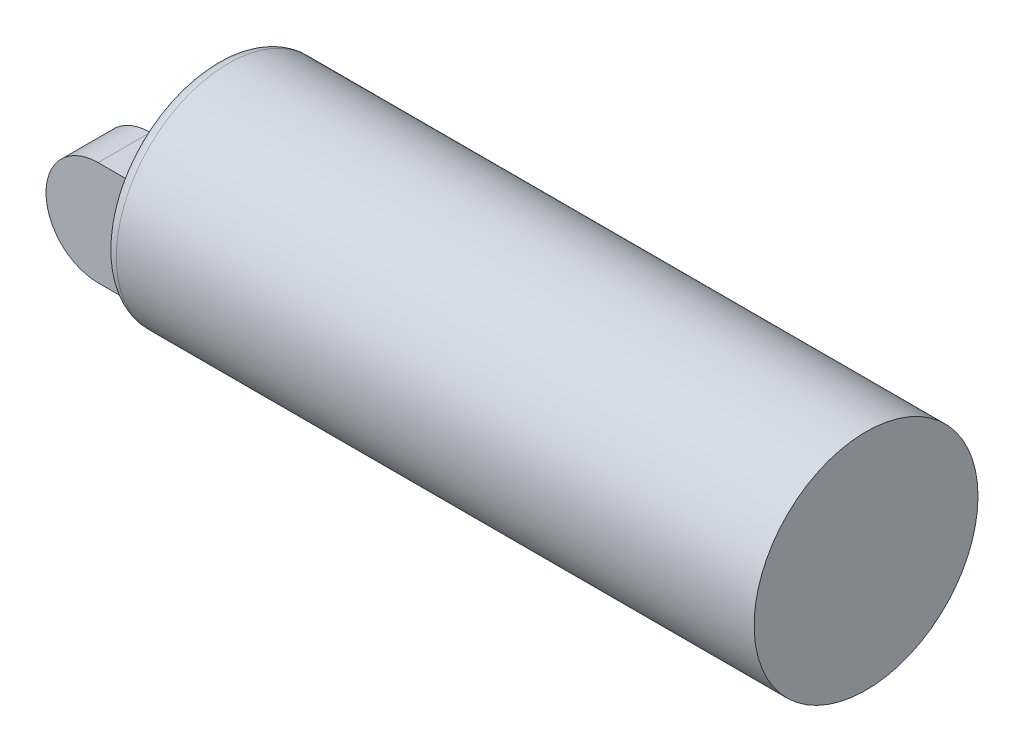
ISO-10303-21;
HEADER;
FILE_DESCRIPTION(('STEP AP214'),'2;1');
FILE_NAME('part.step','',(''),(''),'','','');
FILE_SCHEMA(('AUTOMOTIVE_DESIGN { 1 0 10303 214 1 1 1 1 }'));
ENDSEC;
DATA;
#1=APPLICATION_CONTEXT('core data for automotive mechanical design processes');
#2=APPLICATION_PROTOCOL_DEFINITION('international standard','automotive_design',2000,#1);
#3=PRODUCT_CONTEXT('',#1,'mechanical');
#4=PRODUCT('Part','Part','',(#3));
#5=PRODUCT_RELATED_PRODUCT_CATEGORY('part','',(#4));
#6=PRODUCT_DEFINITION_FORMATION('','',#4);
#7=PRODUCT_DEFINITION_CONTEXT('part definition',#1,'design');
#8=PRODUCT_DEFINITION('design','',#6,#7);
#9=PRODUCT_DEFINITION_SHAPE('','',#8);
#10=(LENGTH_UNIT() NAMED_UNIT(*) SI_UNIT(.MILLI.,.METRE.));
#11=(NAMED_UNIT(*) PLANE_ANGLE_UNIT() SI_UNIT($,.RADIAN.));
#12=(NAMED_UNIT(*) SI_UNIT($,.STERADIAN.) SOLID_ANGLE_UNIT());
#13=UNCERTAINTY_MEASURE_WITH_UNIT(LENGTH_MEASURE(1.E-05),#10,'distance_accuracy_value','');
#14=(GEOMETRIC_REPRESENTATION_CONTEXT(3) GLOBAL_UNCERTAINTY_ASSIGNED_CONTEXT((#13)) GLOBAL_UNIT_ASSIGNED_CONTEXT((#10,
#11,#12)) REPRESENTATION_CONTEXT('',''));
#15=CARTESIAN_POINT('',(0.,0.,0.));
#16=DIRECTION('',(0.,0.,1.));
#17=DIRECTION('',(1.,0.,0.));
#18=AXIS2_PLACEMENT_3D('',#15,#16,#17);
#19=CARTESIAN_POINT('',(-25.,0.,0.));
#20=DIRECTION('',(1.,0.,0.));
#21=DIRECTION('',(0.,0.,-1.));
#22=AXIS2_PLACEMENT_3D('',#19,#20,#21);
#23=PLANE('',#22);
#24=DIRECTION('',(0.,1.,0.));
#25=VECTOR('',#24,1.);
#26=CARTESIAN_POINT('',(-25.,-2.,3.5));
#27=LINE('',#26,#25);
#28=CARTESIAN_POINT('',(-25.,-1.47986485869487,3.5));
#29=VERTEX_POINT('',#28);
#30=CARTESIAN_POINT('',(-25.,1.47986485869487,3.5));
#31=VERTEX_POINT('',#30);
#32=EDGE_CURVE('E157',#29,#31,#27,.T.);
#33=ORIENTED_EDGE('',*,*,#32,.F.);
#34=CARTESIAN_POINT('',(-25.,0.,0.));
#35=DIRECTION('',(1.,0.,0.));
#36=DIRECTION('',(0.,0.,-1.));
#37=AXIS2_PLACEMENT_3D('',#34,#35,#36);
#38=CIRCLE('',#37,3.8);
#39=EDGE_CURVE('E201',#29,#31,#38,.F.);
#40=ORIENTED_EDGE('',*,*,#39,.T.);
#41=EDGE_LOOP('',(#33,#40));
#42=FACE_BOUND('',#41,.T.);
#43=ADVANCED_FACE('F33',(#42),#23,.F.);
#44=DIRECTION('',(0.,0.,1.));
#45=VECTOR('',#44,1.);
#46=CARTESIAN_POINT('',(-25.,2.,-3.5));
#47=LINE('',#46,#45);
#48=CARTESIAN_POINT('',(-25.,2.,1.49));
#49=VERTEX_POINT('',#48);
#50=CARTESIAN_POINT('',(-25.,2.,3.2310988842807));
#51=VERTEX_POINT('',#50);
#52=EDGE_CURVE('E145',#49,#51,#47,.T.);
#53=ORIENTED_EDGE('',*,*,#52,.T.);
#54=CARTESIAN_POINT('',(-25.,0.,0.));
#55=DIRECTION('',(1.,0.,0.));
#56=DIRECTION('',(0.,0.,-1.));
#57=AXIS2_PLACEMENT_3D('',#54,#55,#56);
#58=CIRCLE('',#57,3.8);
#59=CARTESIAN_POINT('',(-25.,2.,-3.2310988842807));
#60=VERTEX_POINT('',#59);
#61=EDGE_CURVE('E199',#51,#60,#58,.F.);
#62=ORIENTED_EDGE('',*,*,#61,.T.);
#63=CARTESIAN_POINT('',(-25.,2.,-1.49));
#64=VERTEX_POINT('',#63);
#65=EDGE_CURVE('E154',#60,#64,#47,.T.);
#66=ORIENTED_EDGE('',*,*,#65,.T.);
#67=DIRECTION('',(0.,-1.,0.));
#68=VECTOR('',#67,1.);
#69=CARTESIAN_POINT('',(-25.,-2.,-1.49));
#70=LINE('',#69,#68);
#71=CARTESIAN_POINT('',(-25.,-2.,-1.49));
#72=VERTEX_POINT('',#71);
#73=EDGE_CURVE('E139',#64,#72,#70,.T.);
#74=ORIENTED_EDGE('',*,*,#73,.T.);
#75=DIRECTION('',(0.,0.,1.));
#76=VECTOR('',#75,1.);
#77=CARTESIAN_POINT('',(-25.,-2.,-3.5));
#78=LINE('',#77,#76);
#79=CARTESIAN_POINT('',(-25.,-2.,-3.2310988842807));
#80=VERTEX_POINT('',#79);
#81=EDGE_CURVE('E164',#80,#72,#78,.T.);
#82=ORIENTED_EDGE('',*,*,#81,.F.);
#83=CARTESIAN_POINT('',(-25.,0.,0.));
#84=DIRECTION('',(1.,0.,0.));
#85=DIRECTION('',(0.,0.,-1.));
#86=AXIS2_PLACEMENT_3D('',#83,#84,#85);
#87=CIRCLE('',#86,3.8);
#88=CARTESIAN_POINT('',(-25.,-2.,3.2310988842807));
#89=VERTEX_POINT('',#88);
#90=EDGE_CURVE('E195',#80,#89,#87,.F.);
#91=ORIENTED_EDGE('',*,*,#90,.T.);
#92=CARTESIAN_POINT('',(-25.,-2.,1.49));
#93=VERTEX_POINT('',#92);
#94=EDGE_CURVE('E148',#93,#89,#78,.T.);
#95=ORIENTED_EDGE('',*,*,#94,.F.);
#96=DIRECTION('',(0.,1.,0.));
#97=VECTOR('',#96,1.);
#98=CARTESIAN_POINT('',(-25.,-2.,1.49));
#99=LINE('',#98,#97);
#100=EDGE_CURVE('E131',#93,#49,#99,.T.);
#101=ORIENTED_EDGE('',*,*,#100,.T.);
#102=EDGE_LOOP('',(#53,#62,#66,#74,#82,#91,#95,#101));
#103=FACE_BOUND('',#102,.T.);
#104=ADVANCED_FACE('F144',(#103),#23,.F.);
#105=CARTESIAN_POINT('',(-26.,0.,3.5));
#106=DIRECTION('',(0.,0.,1.));
#107=DIRECTION('',(1.,0.,0.));
#108=AXIS2_PLACEMENT_3D('',#105,#106,#107);
#109=CYLINDRICAL_SURFACE('',#108,2.);
#110=DIRECTION('',(0.,0.,1.));
#111=VECTOR('',#110,1.);
#112=CARTESIAN_POINT('',(-26.,-2.,-3.5));
#113=LINE('',#112,#111);
#114=CARTESIAN_POINT('',(-26.,-2.,3.5));
#115=VERTEX_POINT('',#114);
#116=CARTESIAN_POINT('',(-26.,-2.,1.49));
#117=VERTEX_POINT('',#116);
#118=EDGE_CURVE('E184',#115,#117,#113,.F.);
#119=ORIENTED_EDGE('',*,*,#118,.F.);
#120=CARTESIAN_POINT('',(-26.,0.,3.5));
#121=DIRECTION('',(0.,0.,-1.));
#122=DIRECTION('',(-1.,0.,0.));
#123=AXIS2_PLACEMENT_3D('',#120,#121,#122);
#124=CIRCLE('',#123,2.);
#125=CARTESIAN_POINT('',(-26.,2.,3.5));
#126=VERTEX_POINT('',#125);
#127=EDGE_CURVE('E189',#126,#115,#124,.F.);
#128=ORIENTED_EDGE('',*,*,#127,.F.);
#129=DIRECTION('',(0.,0.,-1.));
#130=VECTOR('',#129,1.);
#131=CARTESIAN_POINT('',(-26.,2.,3.5));
#132=LINE('',#131,#130);
#133=CARTESIAN_POINT('',(-26.,2.,1.49));
#134=VERTEX_POINT('',#133);
#135=EDGE_CURVE('E187',#134,#126,#132,.F.);
#136=ORIENTED_EDGE('',*,*,#135,.F.);
#137=CARTESIAN_POINT('',(-26.,0.,1.49));
#138=DIRECTION('',(0.,0.,1.));
#139=DIRECTION('',(1.,0.,0.));
#140=AXIS2_PLACEMENT_3D('',#137,#138,#139);
#141=CIRCLE('',#140,2.);
#142=EDGE_CURVE('E133',#117,#134,#141,.F.);
#143=ORIENTED_EDGE('',*,*,#142,.F.);
#144=EDGE_LOOP('',(#119,#128,#136,#143));
#145=FACE_BOUND('',#144,.T.);
#146=ADVANCED_FACE('F273',(#145),#109,.T.);
#147=CARTESIAN_POINT('',(-25.,-2.,1.49));
#148=DIRECTION('',(0.,0.,1.));
#149=DIRECTION('',(1.,0.,0.));
#150=AXIS2_PLACEMENT_3D('',#147,#148,#149);
#151=PLANE('',#150);
#152=DIRECTION('',(-1.,0.,0.));
#153=VECTOR('',#152,1.);
#154=CARTESIAN_POINT('',(-25.,-2.,1.49));
#155=LINE('',#154,#153);
#156=EDGE_CURVE('E159',#93,#117,#155,.T.);
#157=ORIENTED_EDGE('',*,*,#156,.T.);
#158=ORIENTED_EDGE('',*,*,#142,.T.);
#159=DIRECTION('',(-1.,0.,0.));
#160=VECTOR('',#159,1.);
#161=CARTESIAN_POINT('',(-25.,2.,1.49));
#162=LINE('',#161,#160);
#163=EDGE_CURVE('E126',#49,#134,#162,.T.);
#164=ORIENTED_EDGE('',*,*,#163,.F.);
#165=ORIENTED_EDGE('',*,*,#100,.F.);
#166=EDGE_LOOP('',(#157,#158,#164,#165));
#167=FACE_BOUND('',#166,.T.);
#168=CARTESIAN_POINT('',(-26.63,0.,1.49));
#169=DIRECTION('',(0.,0.,1.));
#170=DIRECTION('',(1.,0.,0.));
#171=AXIS2_PLACEMENT_3D('',#168,#169,#170);
#172=CIRCLE('',#171,0.9);
#173=CARTESIAN_POINT('',(-25.73,0.,1.49));
#174=VERTEX_POINT('',#173);
#175=EDGE_CURVE('E320',#174,#174,#172,.T.);
#176=ORIENTED_EDGE('',*,*,#175,.T.);
#177=EDGE_LOOP('',(#176));
#178=FACE_BOUND('',#177,.T.);
#179=ADVANCED_FACE('F129',(#167,#178),#151,.F.);
#180=CARTESIAN_POINT('',(-26.,0.,-1.49));
#181=DIRECTION('',(0.,0.,1.));
#182=DIRECTION('',(1.,0.,0.));
#183=AXIS2_PLACEMENT_3D('',#180,#181,#182);
#184=CYLINDRICAL_SURFACE('',#183,2.);
#185=DIRECTION('',(0.,0.,1.));
#186=VECTOR('',#185,1.);
#187=CARTESIAN_POINT('',(-26.,-2.,-3.5));
#188=LINE('',#187,#186);
#189=CARTESIAN_POINT('',(-26.,-2.,-1.49));
#190=VERTEX_POINT('',#189);
#191=CARTESIAN_POINT('',(-26.,-2.,-3.5));
#192=VERTEX_POINT('',#191);
#193=EDGE_CURVE('E175',#190,#192,#188,.F.);
#194=ORIENTED_EDGE('',*,*,#193,.F.);
#195=CARTESIAN_POINT('',(-26.,0.,-1.49));
#196=DIRECTION('',(0.,0.,-1.));
#197=DIRECTION('',(-1.,0.,0.));
#198=AXIS2_PLACEMENT_3D('',#195,#196,#197);
#199=CIRCLE('',#198,2.);
#200=CARTESIAN_POINT('',(-26.,2.,-1.49));
#201=VERTEX_POINT('',#200);
#202=EDGE_CURVE('E180',#201,#190,#199,.F.);
#203=ORIENTED_EDGE('',*,*,#202,.F.);
#204=DIRECTION('',(0.,0.,-1.));
#205=VECTOR('',#204,1.);
#206=CARTESIAN_POINT('',(-26.,2.,-1.49));
#207=LINE('',#206,#205);
#208=CARTESIAN_POINT('',(-26.,2.,-3.5));
#209=VERTEX_POINT('',#208);
#210=EDGE_CURVE('E177',#209,#201,#207,.F.);
#211=ORIENTED_EDGE('',*,*,#210,.F.);
#212=CARTESIAN_POINT('',(-26.,0.,-3.5));
#213=DIRECTION('',(0.,0.,-1.));
#214=DIRECTION('',(-1.,0.,0.));
#215=AXIS2_PLACEMENT_3D('',#212,#213,#214);
#216=CIRCLE('',#215,2.);
#217=EDGE_CURVE('E182',#192,#209,#216,.T.);
#218=ORIENTED_EDGE('',*,*,#217,.F.);
#219=EDGE_LOOP('',(#194,#203,#211,#218));
#220=FACE_BOUND('',#219,.T.);
#221=ADVANCED_FACE('F298',(#220),#184,.T.);
#222=CARTESIAN_POINT('',(-28.,-2.,-3.5));
#223=DIRECTION('',(0.,1.,0.));
#224=DIRECTION('',(0.,0.,1.));
#225=AXIS2_PLACEMENT_3D('',#222,#223,#224);
#226=PLANE('',#225);
#227=DIRECTION('',(1.,0.,0.));
#228=VECTOR('',#227,1.);
#229=CARTESIAN_POINT('',(-28.,-2.,3.5));
#230=LINE('',#229,#228);
#231=CARTESIAN_POINT('',(-24.9433728042342,-2.,3.5));
#232=VERTEX_POINT('',#231);
#233=EDGE_CURVE('E52',#115,#232,#230,.T.);
#234=ORIENTED_EDGE('',*,*,#233,.F.);
#235=ORIENTED_EDGE('',*,*,#118,.T.);
#236=ORIENTED_EDGE('',*,*,#156,.F.);
#237=ORIENTED_EDGE('',*,*,#94,.T.);
#238=CARTESIAN_POINT('',(-25.,-2.,3.2310988842807));
#239=CARTESIAN_POINT('',(-25.0000224286856,-2.,3.26799843064316));
#240=CARTESIAN_POINT('',(-24.9970462157719,-2.,3.30499777397735));
#241=CARTESIAN_POINT('',(-24.9851167834726,-2.,3.37732640569633));
#242=CARTESIAN_POINT('',(-24.9762719738994,-2.,3.41267375945055));
#243=CARTESIAN_POINT('',(-24.9613562752155,-2.,3.45593418573264));
#244=CARTESIAN_POINT('',(-24.9580571959606,-2.,3.46483796510696));
#245=CARTESIAN_POINT('',(-24.9510333023544,-2.,3.48252516810575));
#246=CARTESIAN_POINT('',(-24.9473065303777,-2.,3.49130781403996));
#247=CARTESIAN_POINT('',(-24.9433728042342,-2.,3.5));
#248=B_SPLINE_CURVE_WITH_KNOTS('',3,(#238,#239,#240,#241,#242,#243,#244,#245,#246,#247),
.UNSPECIFIED.,.F.,.F.,(4,2,2,2,4),(0.,0.110755261121068,0.219519486984609,0.247997830641225,
0.276612155591879),.UNSPECIFIED.);
#249=EDGE_CURVE('E46',#89,#232,#248,.T.);
#250=ORIENTED_EDGE('',*,*,#249,.T.);
#251=EDGE_LOOP('',(#234,#235,#236,#237,#250));
#252=FACE_BOUND('',#251,.T.);
#253=ADVANCED_FACE('F259',(#252),#226,.F.);
#254=CARTESIAN_POINT('',(-28.,2.,-3.5));
#255=DIRECTION('',(0.,1.,0.));
#256=DIRECTION('',(0.,0.,1.));
#257=AXIS2_PLACEMENT_3D('',#254,#255,#256);
#258=PLANE('',#257);
#259=ORIENTED_EDGE('',*,*,#163,.T.);
#260=ORIENTED_EDGE('',*,*,#135,.T.);
#261=DIRECTION('',(1.,0.,0.));
#262=VECTOR('',#261,1.);
#263=CARTESIAN_POINT('',(-28.,2.,3.5));
#264=LINE('',#263,#262);
#265=CARTESIAN_POINT('',(-24.9433728042342,2.,3.5));
#266=VERTEX_POINT('',#265);
#267=EDGE_CURVE('E170',#126,#266,#264,.T.);
#268=ORIENTED_EDGE('',*,*,#267,.T.);
#269=CARTESIAN_POINT('',(-24.9433728042342,2.,3.5));
#270=CARTESIAN_POINT('',(-24.9586289969678,2.,3.46631388491358));
#271=CARTESIAN_POINT('',(-24.9707464773621,2.,3.43127983098381));
#272=CARTESIAN_POINT('',(-24.9886851201952,2.,3.36026003953303));
#273=CARTESIAN_POINT('',(-24.9946100421791,2.,3.32430068713728));
#274=CARTESIAN_POINT('',(-24.9992168971913,2.,3.26915001534335));
#275=CARTESIAN_POINT('',(-25.0000031898991,2.,3.25011531646974));
#276=CARTESIAN_POINT('',(-25.,2.,3.2310988842807));
#277=B_SPLINE_CURVE_WITH_KNOTS('',3,(#269,#270,#271,#272,#273,#274,#275,#276),.UNSPECIFIED.,.F.,
.F.,(4,2,2,4),(0.,0.110697893019595,0.219509705841096,0.276585237461115),.UNSPECIFIED.);
#278=EDGE_CURVE('E153',#266,#51,#277,.T.);
#279=ORIENTED_EDGE('',*,*,#278,.T.);
#280=ORIENTED_EDGE('',*,*,#52,.F.);
#281=EDGE_LOOP('',(#259,#260,#268,#279,#280));
#282=FACE_BOUND('',#281,.T.);
#283=ADVANCED_FACE('F151',(#282),#258,.T.);
#284=CARTESIAN_POINT('',(-25.,0.,0.));
#285=DIRECTION('',(1.,0.,0.));
#286=DIRECTION('',(0.,0.,-1.));
#287=AXIS2_PLACEMENT_3D('',#284,#285,#286);
#288=CYLINDRICAL_SURFACE('',#287,4.3);
#289=CARTESIAN_POINT('',(-24.5,0.,0.));
#290=DIRECTION('',(1.,0.,0.));
#291=DIRECTION('',(0.,0.,-1.));
#292=AXIS2_PLACEMENT_3D('',#289,#290,#291);
#293=CIRCLE('',#292,4.3);
#294=CARTESIAN_POINT('',(-24.5,0.,-4.3));
#295=VERTEX_POINT('',#294);
#296=EDGE_CURVE('E192',#295,#295,#293,.T.);
#297=ORIENTED_EDGE('',*,*,#296,.T.);
#298=EDGE_LOOP('',(#297));
#299=FACE_BOUND('',#298,.T.);
#300=CARTESIAN_POINT('',(0.,0.,0.));
#301=DIRECTION('',(1.,0.,0.));
#302=DIRECTION('',(0.,0.,-1.));
#303=AXIS2_PLACEMENT_3D('',#300,#301,#302);
#304=CIRCLE('',#303,4.3);
#305=CARTESIAN_POINT('',(0.,0.,-4.3));
#306=VERTEX_POINT('',#305);
#307=EDGE_CURVE('E168',#306,#306,#304,.T.);
#308=ORIENTED_EDGE('',*,*,#307,.F.);
#309=EDGE_LOOP('',(#308));
#310=FACE_BOUND('',#309,.T.);
#311=ADVANCED_FACE('F277',(#299,#310),#288,.T.);
#312=DIRECTION('',(0.,1.,0.));
#313=VECTOR('',#312,1.);
#314=CARTESIAN_POINT('',(-25.,-2.,-3.5));
#315=LINE('',#314,#313);
#316=CARTESIAN_POINT('',(-25.,-1.47986485869487,-3.5));
#317=VERTEX_POINT('',#316);
#318=CARTESIAN_POINT('',(-25.,1.47986485869487,-3.5));
#319=VERTEX_POINT('',#318);
#320=EDGE_CURVE('E155',#317,#319,#315,.T.);
#321=ORIENTED_EDGE('',*,*,#320,.T.);
#322=CARTESIAN_POINT('',(-25.,0.,0.));
#323=DIRECTION('',(1.,0.,0.));
#324=DIRECTION('',(0.,0.,-1.));
#325=AXIS2_PLACEMENT_3D('',#322,#323,#324);
#326=CIRCLE('',#325,3.8);
#327=EDGE_CURVE('E197',#319,#317,#326,.F.);
#328=ORIENTED_EDGE('',*,*,#327,.T.);
#329=EDGE_LOOP('',(#321,#328));
#330=FACE_BOUND('',#329,.T.);
#331=ADVANCED_FACE('F268',(#330),#23,.F.);
#332=CARTESIAN_POINT('',(0.,0.,0.));
#333=DIRECTION('',(1.,0.,0.));
#334=DIRECTION('',(0.,0.,-1.));
#335=AXIS2_PLACEMENT_3D('',#332,#333,#334);
#336=PLANE('',#335);
#337=ORIENTED_EDGE('',*,*,#307,.T.);
#338=EDGE_LOOP('',(#337));
#339=FACE_BOUND('',#338,.T.);
#340=ADVANCED_FACE('F276',(#339),#336,.T.);
#341=CARTESIAN_POINT('',(-28.,-2.,-3.5));
#342=DIRECTION('',(0.,0.,-1.));
#343=DIRECTION('',(-1.,0.,0.));
#344=AXIS2_PLACEMENT_3D('',#341,#342,#343);
#345=PLANE('',#344);
#346=DIRECTION('',(1.,0.,0.));
#347=VECTOR('',#346,1.);
#348=CARTESIAN_POINT('',(-28.,-2.,-3.5));
#349=LINE('',#348,#347);
#350=CARTESIAN_POINT('',(-24.9433728042342,-2.,-3.5));
#351=VERTEX_POINT('',#350);
#352=EDGE_CURVE('E60',#192,#351,#349,.T.);
#353=ORIENTED_EDGE('',*,*,#352,.F.);
#354=ORIENTED_EDGE('',*,*,#217,.T.);
#355=DIRECTION('',(1.,0.,0.));
#356=VECTOR('',#355,1.);
#357=CARTESIAN_POINT('',(-28.,2.,-3.5));
#358=LINE('',#357,#356);
#359=CARTESIAN_POINT('',(-24.9433728042342,2.,-3.5));
#360=VERTEX_POINT('',#359);
#361=EDGE_CURVE('E166',#209,#360,#358,.T.);
#362=ORIENTED_EDGE('',*,*,#361,.T.);
#363=CARTESIAN_POINT('',(-24.9433728042342,2.,-3.5));
#364=CARTESIAN_POINT('',(-24.9543202386034,1.95752462015798,-3.5));
#365=CARTESIAN_POINT('',(-24.9632912168686,1.91460189631565,-3.5));
#366=CARTESIAN_POINT('',(-24.9779025624653,1.82835615793533,-3.5));
#367=CARTESIAN_POINT('',(-24.9835557509957,1.78503535023548,-3.5));
#368=CARTESIAN_POINT('',(-24.9922236824024,1.69820403557088,-3.5));
#369=CARTESIAN_POINT('',(-24.9952415601314,1.65469381604158,-3.5));
#370=CARTESIAN_POINT('',(-24.9991281690942,1.56740399604023,-3.5));
#371=CARTESIAN_POINT('',(-24.9999884992702,1.52362400592514,-3.5));
#372=CARTESIAN_POINT('',(-25.,1.47986485869487,-3.5));
#373=B_SPLINE_CURVE_WITH_KNOTS('',3,(#363,#364,#365,#366,#367,#368,#369,#370,#371,#372),
.UNSPECIFIED.,.F.,.F.,(4,2,2,2,4),(0.,0.131457888466224,0.262404370586673,0.393194871360669,
0.524493858895249),.UNSPECIFIED.);
#374=EDGE_CURVE('E239',#360,#319,#373,.T.);
#375=ORIENTED_EDGE('',*,*,#374,.T.);
#376=ORIENTED_EDGE('',*,*,#320,.F.);
#377=CARTESIAN_POINT('',(-25.,-1.47986485869487,-3.5));
#378=CARTESIAN_POINT('',(-24.9999884992702,-1.52362400592514,-3.5));
#379=CARTESIAN_POINT('',(-24.9991281690942,-1.56740399604023,-3.5));
#380=CARTESIAN_POINT('',(-24.9952415601314,-1.65469381604158,-3.5));
#381=CARTESIAN_POINT('',(-24.9922236824024,-1.69820403557088,-3.5));
#382=CARTESIAN_POINT('',(-24.9835557509957,-1.78503535023548,-3.5));
#383=CARTESIAN_POINT('',(-24.9779025624653,-1.82835615793533,-3.5));
#384=CARTESIAN_POINT('',(-24.9632912168686,-1.91460189631565,-3.5));
#385=CARTESIAN_POINT('',(-24.9543202386034,-1.95752462015798,-3.5));
#386=CARTESIAN_POINT('',(-24.9433728042342,-2.,-3.5));
#387=B_SPLINE_CURVE_WITH_KNOTS('',3,(#377,#378,#379,#380,#381,#382,#383,#384,#385,#386),
.UNSPECIFIED.,.F.,.F.,(4,2,2,2,4),(0.,0.13129898753458,0.262089488308577,0.393035970429025,
0.52449385889525),.UNSPECIFIED.);
#388=EDGE_CURVE('E244',#317,#351,#387,.T.);
#389=ORIENTED_EDGE('',*,*,#388,.T.);
#390=EDGE_LOOP('',(#353,#354,#362,#375,#376,#389));
#391=FACE_BOUND('',#390,.T.);
#392=ADVANCED_FACE('F229',(#391),#345,.T.);
#393=DIRECTION('',(-1.,0.,0.));
#394=VECTOR('',#393,1.);
#395=CARTESIAN_POINT('',(-25.,-2.,-1.49));
#396=LINE('',#395,#394);
#397=EDGE_CURVE('E308',#72,#190,#396,.T.);
#398=ORIENTED_EDGE('',*,*,#397,.T.);
#399=ORIENTED_EDGE('',*,*,#193,.T.);
#400=ORIENTED_EDGE('',*,*,#352,.T.);
#401=CARTESIAN_POINT('',(-24.9433728042342,-2.,-3.5));
#402=CARTESIAN_POINT('',(-24.9586289969678,-2.,-3.46631388491358));
#403=CARTESIAN_POINT('',(-24.9707464773621,-2.,-3.43127983098381));
#404=CARTESIAN_POINT('',(-24.9886851201952,-2.,-3.36026003953303));
#405=CARTESIAN_POINT('',(-24.9946100421791,-2.,-3.32430068713728));
#406=CARTESIAN_POINT('',(-24.9992168971913,-2.,-3.26915001534335));
#407=CARTESIAN_POINT('',(-25.0000031898991,-2.,-3.25011531646974));
#408=CARTESIAN_POINT('',(-25.,-2.,-3.2310988842807));
#409=B_SPLINE_CURVE_WITH_KNOTS('',3,(#401,#402,#403,#404,#405,#406,#407,#408),.UNSPECIFIED.,.F.,
.F.,(4,2,2,4),(0.,0.110697893019595,0.219509705841096,0.276585237461116),.UNSPECIFIED.);
#410=EDGE_CURVE('E249',#351,#80,#409,.T.);
#411=ORIENTED_EDGE('',*,*,#410,.T.);
#412=ORIENTED_EDGE('',*,*,#81,.T.);
#413=EDGE_LOOP('',(#398,#399,#400,#411,#412));
#414=FACE_BOUND('',#413,.T.);
#415=ADVANCED_FACE('F220',(#414),#226,.F.);
#416=CARTESIAN_POINT('',(-28.,-2.,3.5));
#417=DIRECTION('',(0.,0.,-1.));
#418=DIRECTION('',(-1.,0.,0.));
#419=AXIS2_PLACEMENT_3D('',#416,#417,#418);
#420=PLANE('',#419);
#421=ORIENTED_EDGE('',*,*,#267,.F.);
#422=ORIENTED_EDGE('',*,*,#127,.T.);
#423=ORIENTED_EDGE('',*,*,#233,.T.);
#424=CARTESIAN_POINT('',(-24.9433728042342,-2.,3.5));
#425=CARTESIAN_POINT('',(-24.9543202386034,-1.95752462015798,3.5));
#426=CARTESIAN_POINT('',(-24.9632912168686,-1.91460189631565,3.5));
#427=CARTESIAN_POINT('',(-24.9779025624653,-1.82835615793533,3.5));
#428=CARTESIAN_POINT('',(-24.9835557509957,-1.78503535023548,3.5));
#429=CARTESIAN_POINT('',(-24.9922236824024,-1.69820403557088,3.5));
#430=CARTESIAN_POINT('',(-24.9952415601314,-1.65469381604158,3.5));
#431=CARTESIAN_POINT('',(-24.9991281690942,-1.56740399604023,3.5));
#432=CARTESIAN_POINT('',(-24.9999884992702,-1.52362400592514,3.5));
#433=CARTESIAN_POINT('',(-25.,-1.47986485869487,3.5));
#434=B_SPLINE_CURVE_WITH_KNOTS('',3,(#424,#425,#426,#427,#428,#429,#430,#431,#432,#433),
.UNSPECIFIED.,.F.,.F.,(4,2,2,2,4),(0.,0.131457888466225,0.262404370586673,0.39319487136067,
0.52449385889525),.UNSPECIFIED.);
#435=EDGE_CURVE('E11',#232,#29,#434,.T.);
#436=ORIENTED_EDGE('',*,*,#435,.T.);
#437=ORIENTED_EDGE('',*,*,#32,.T.);
#438=CARTESIAN_POINT('',(-25.,1.47986485869487,3.5));
#439=CARTESIAN_POINT('',(-24.9999884992702,1.52362400592514,3.5));
#440=CARTESIAN_POINT('',(-24.9991281690942,1.56740399604023,3.5));
#441=CARTESIAN_POINT('',(-24.9952415601314,1.65469381604158,3.5));
#442=CARTESIAN_POINT('',(-24.9922236824024,1.69820403557088,3.5));
#443=CARTESIAN_POINT('',(-24.9835557509957,1.78503535023548,3.5));
#444=CARTESIAN_POINT('',(-24.9779025624653,1.82835615793533,3.5));
#445=CARTESIAN_POINT('',(-24.9632912168686,1.91460189631565,3.5));
#446=CARTESIAN_POINT('',(-24.9543202386034,1.95752462015798,3.5));
#447=CARTESIAN_POINT('',(-24.9433728042342,2.,3.5));
#448=B_SPLINE_CURVE_WITH_KNOTS('',3,(#438,#439,#440,#441,#442,#443,#444,#445,#446,#447),
.UNSPECIFIED.,.F.,.F.,(4,2,2,2,4),(0.,0.13129898753458,0.262089488308577,0.393035970429025,
0.524493858895249),.UNSPECIFIED.);
#449=EDGE_CURVE('E204',#31,#266,#448,.T.);
#450=ORIENTED_EDGE('',*,*,#449,.T.);
#451=EDGE_LOOP('',(#421,#422,#423,#436,#437,#450));
#452=FACE_BOUND('',#451,.T.);
#453=ADVANCED_FACE('F215',(#452),#420,.F.);
#454=ORIENTED_EDGE('',*,*,#361,.F.);
#455=ORIENTED_EDGE('',*,*,#210,.T.);
#456=DIRECTION('',(-1.,0.,0.));
#457=VECTOR('',#456,1.);
#458=CARTESIAN_POINT('',(-25.,2.,-1.49));
#459=LINE('',#458,#457);
#460=EDGE_CURVE('E138',#64,#201,#459,.T.);
#461=ORIENTED_EDGE('',*,*,#460,.F.);
#462=ORIENTED_EDGE('',*,*,#65,.F.);
#463=CARTESIAN_POINT('',(-25.,2.,-3.2310988842807));
#464=CARTESIAN_POINT('',(-25.0000224286856,2.,-3.26799843064316));
#465=CARTESIAN_POINT('',(-24.9970462157719,2.,-3.30499777397735));
#466=CARTESIAN_POINT('',(-24.9851167834726,2.,-3.37732640569633));
#467=CARTESIAN_POINT('',(-24.9762719738994,2.,-3.41267375945055));
#468=CARTESIAN_POINT('',(-24.9613562752155,2.,-3.45593418573264));
#469=CARTESIAN_POINT('',(-24.9580571959606,2.,-3.46483796510696));
#470=CARTESIAN_POINT('',(-24.9510333023544,2.,-3.48252516810576));
#471=CARTESIAN_POINT('',(-24.9473065303777,2.,-3.49130781403996));
#472=CARTESIAN_POINT('',(-24.9433728042342,2.,-3.5));
#473=B_SPLINE_CURVE_WITH_KNOTS('',3,(#463,#464,#465,#466,#467,#468,#469,#470,#471,#472),
.UNSPECIFIED.,.F.,.F.,(4,2,2,2,4),(0.,0.110755261121068,0.219519486984609,0.247997830641225,
0.276612155591879),.UNSPECIFIED.);
#474=EDGE_CURVE('E233',#60,#360,#473,.T.);
#475=ORIENTED_EDGE('',*,*,#474,.T.);
#476=EDGE_LOOP('',(#454,#455,#461,#462,#475));
#477=FACE_BOUND('',#476,.T.);
#478=ADVANCED_FACE('F219',(#477),#258,.T.);
#479=CARTESIAN_POINT('',(-25.,-2.,-1.49));
#480=DIRECTION('',(0.,0.,-1.));
#481=DIRECTION('',(-1.,0.,0.));
#482=AXIS2_PLACEMENT_3D('',#479,#480,#481);
#483=PLANE('',#482);
#484=CARTESIAN_POINT('',(-26.63,0.,-1.49));
#485=DIRECTION('',(0.,0.,1.));
#486=DIRECTION('',(1.,0.,0.));
#487=AXIS2_PLACEMENT_3D('',#484,#485,#486);
#488=CIRCLE('',#487,0.9);
#489=CARTESIAN_POINT('',(-25.73,0.,-1.49));
#490=VERTEX_POINT('',#489);
#491=EDGE_CURVE('E314',#490,#490,#488,.T.);
#492=ORIENTED_EDGE('',*,*,#491,.F.);
#493=EDGE_LOOP('',(#492));
#494=FACE_BOUND('',#493,.T.);
#495=ORIENTED_EDGE('',*,*,#460,.T.);
#496=ORIENTED_EDGE('',*,*,#202,.T.);
#497=ORIENTED_EDGE('',*,*,#397,.F.);
#498=ORIENTED_EDGE('',*,*,#73,.F.);
#499=EDGE_LOOP('',(#495,#496,#497,#498));
#500=FACE_BOUND('',#499,.T.);
#501=ADVANCED_FACE('F227',(#494,#500),#483,.F.);
#502=CARTESIAN_POINT('',(-26.63,0.,-3.49));
#503=DIRECTION('',(0.,0.,1.));
#504=DIRECTION('',(1.,0.,0.));
#505=AXIS2_PLACEMENT_3D('',#502,#503,#504);
#506=CYLINDRICAL_SURFACE('',#505,0.9);
#507=CARTESIAN_POINT('',(-26.63,0.,-3.49));
#508=DIRECTION('',(0.,0.,1.));
#509=DIRECTION('',(1.,0.,0.));
#510=AXIS2_PLACEMENT_3D('',#507,#508,#509);
#511=CIRCLE('',#510,0.9);
#512=CARTESIAN_POINT('',(-25.73,0.,-3.49));
#513=VERTEX_POINT('',#512);
#514=EDGE_CURVE('E149',#513,#513,#511,.T.);
#515=ORIENTED_EDGE('',*,*,#514,.F.);
#516=EDGE_LOOP('',(#515));
#517=FACE_BOUND('',#516,.T.);
#518=ORIENTED_EDGE('',*,*,#491,.T.);
#519=EDGE_LOOP('',(#518));
#520=FACE_BOUND('',#519,.T.);
#521=ADVANCED_FACE('F342',(#517,#520),#506,.F.);
#522=CARTESIAN_POINT('',(-26.63,0.,-3.49));
#523=DIRECTION('',(0.,0.,1.));
#524=DIRECTION('',(1.,0.,0.));
#525=AXIS2_PLACEMENT_3D('',#522,#523,#524);
#526=PLANE('',#525);
#527=ORIENTED_EDGE('',*,*,#514,.T.);
#528=EDGE_LOOP('',(#527));
#529=FACE_BOUND('',#528,.T.);
#530=ADVANCED_FACE('F337',(#529),#526,.T.);
#531=CARTESIAN_POINT('',(-26.63,0.,3.49));
#532=DIRECTION('',(0.,0.,-1.));
#533=DIRECTION('',(-1.,0.,0.));
#534=AXIS2_PLACEMENT_3D('',#531,#532,#533);
#535=CYLINDRICAL_SURFACE('',#534,0.9);
#536=CARTESIAN_POINT('',(-26.63,0.,3.49));
#537=DIRECTION('',(0.,0.,1.));
#538=DIRECTION('',(1.,0.,0.));
#539=AXIS2_PLACEMENT_3D('',#536,#537,#538);
#540=CIRCLE('',#539,0.9);
#541=CARTESIAN_POINT('',(-25.73,0.,3.49));
#542=VERTEX_POINT('',#541);
#543=EDGE_CURVE('E317',#542,#542,#540,.T.);
#544=ORIENTED_EDGE('',*,*,#543,.T.);
#545=EDGE_LOOP('',(#544));
#546=FACE_BOUND('',#545,.T.);
#547=ORIENTED_EDGE('',*,*,#175,.F.);
#548=EDGE_LOOP('',(#547));
#549=FACE_BOUND('',#548,.T.);
#550=ADVANCED_FACE('F326',(#546,#549),#535,.F.);
#551=CARTESIAN_POINT('',(-26.63,0.,3.49));
#552=DIRECTION('',(0.,0.,-1.));
#553=DIRECTION('',(1.,0.,0.));
#554=AXIS2_PLACEMENT_3D('',#551,#552,#553);
#555=PLANE('',#554);
#556=ORIENTED_EDGE('',*,*,#543,.F.);
#557=EDGE_LOOP('',(#556));
#558=FACE_BOUND('',#557,.T.);
#559=ADVANCED_FACE('F329',(#558),#555,.T.);
#560=CARTESIAN_POINT('',(-24.5,0.,0.));
#561=DIRECTION('',(1.,0.,0.));
#562=DIRECTION('',(0.,0.,-1.));
#563=AXIS2_PLACEMENT_3D('',#560,#561,#562);
#564=TOROIDAL_SURFACE('',#563,3.8,0.5);
#565=ORIENTED_EDGE('',*,*,#449,.F.);
#566=ORIENTED_EDGE('',*,*,#39,.F.);
#567=ORIENTED_EDGE('',*,*,#435,.F.);
#568=ORIENTED_EDGE('',*,*,#249,.F.);
#569=ORIENTED_EDGE('',*,*,#90,.F.);
#570=ORIENTED_EDGE('',*,*,#410,.F.);
#571=ORIENTED_EDGE('',*,*,#388,.F.);
#572=ORIENTED_EDGE('',*,*,#327,.F.);
#573=ORIENTED_EDGE('',*,*,#374,.F.);
#574=ORIENTED_EDGE('',*,*,#474,.F.);
#575=ORIENTED_EDGE('',*,*,#61,.F.);
#576=ORIENTED_EDGE('',*,*,#278,.F.);
#577=EDGE_LOOP('',(#565,#566,#567,#568,#569,#570,#571,#572,#573,#574,#575,#576));
#578=FACE_BOUND('',#577,.T.);
#579=ORIENTED_EDGE('',*,*,#296,.F.);
#580=EDGE_LOOP('',(#579));
#581=FACE_BOUND('',#580,.T.);
#582=ADVANCED_FACE('F35',(#578,#581),#564,.T.);
#583=CLOSED_SHELL('',(#43,#104,#146,#179,#221,#253,#283,#311,#331,#340,#392,#415,#453,#478,#501,
#521,#530,#550,#559,#582));
#584=MANIFOLD_SOLID_BREP('B2',#583);
#585=ADVANCED_BREP_SHAPE_REPRESENTATION('',(#18,#584),#14);
#586=SHAPE_DEFINITION_REPRESENTATION(#9,#585);
ENDSEC;
END-ISO-10303-21;
